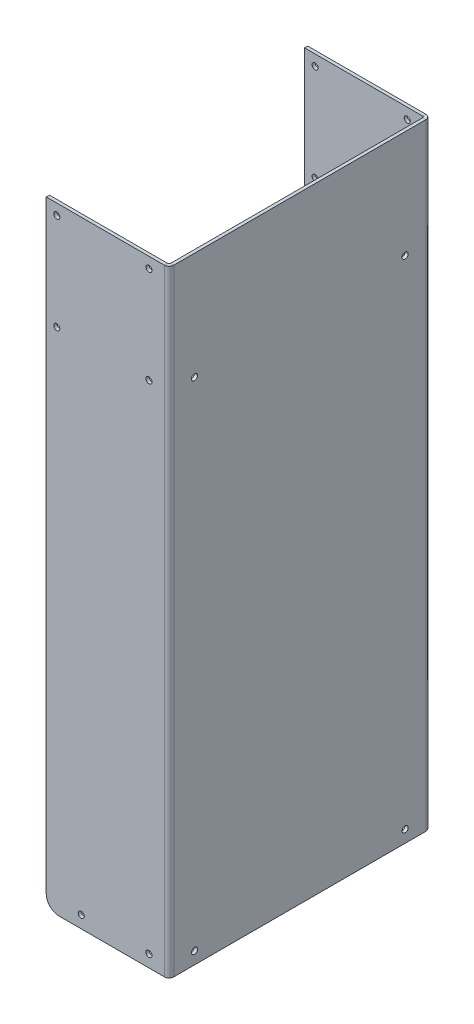
ISO-10303-21;
HEADER;
FILE_DESCRIPTION(('STEP AP214'),'2;1');
FILE_NAME('part.step','',(''),(''),'','','');
FILE_SCHEMA(('AUTOMOTIVE_DESIGN { 1 0 10303 214 1 1 1 1 }'));
ENDSEC;
DATA;
#1=APPLICATION_CONTEXT('core data for automotive mechanical design processes');
#2=APPLICATION_PROTOCOL_DEFINITION('international standard','automotive_design',2000,#1);
#3=PRODUCT_CONTEXT('',#1,'mechanical');
#4=PRODUCT('Part','Part','',(#3));
#5=PRODUCT_RELATED_PRODUCT_CATEGORY('part','',(#4));
#6=PRODUCT_DEFINITION_FORMATION('','',#4);
#7=PRODUCT_DEFINITION_CONTEXT('part definition',#1,'design');
#8=PRODUCT_DEFINITION('design','',#6,#7);
#9=PRODUCT_DEFINITION_SHAPE('','',#8);
#10=(LENGTH_UNIT() NAMED_UNIT(*) SI_UNIT(.MILLI.,.METRE.));
#11=(NAMED_UNIT(*) PLANE_ANGLE_UNIT() SI_UNIT($,.RADIAN.));
#12=(NAMED_UNIT(*) SI_UNIT($,.STERADIAN.) SOLID_ANGLE_UNIT());
#13=UNCERTAINTY_MEASURE_WITH_UNIT(LENGTH_MEASURE(1.E-05),#10,'distance_accuracy_value','');
#14=(GEOMETRIC_REPRESENTATION_CONTEXT(3) GLOBAL_UNCERTAINTY_ASSIGNED_CONTEXT((#13)) GLOBAL_UNIT_ASSIGNED_CONTEXT((#10,
#11,#12)) REPRESENTATION_CONTEXT('',''));
#15=CARTESIAN_POINT('',(0.,0.,0.));
#16=DIRECTION('',(0.,0.,1.));
#17=DIRECTION('',(1.,0.,0.));
#18=AXIS2_PLACEMENT_3D('',#15,#16,#17);
#19=CARTESIAN_POINT('',(1.57,152.4,62.315));
#20=DIRECTION('',(0.,-1.,0.));
#21=DIRECTION('',(0.,0.,-1.));
#22=AXIS2_PLACEMENT_3D('',#19,#20,#21);
#23=PLANE('',#22);
#24=DIRECTION('',(0.,0.,1.));
#25=VECTOR('',#24,1.);
#26=CARTESIAN_POINT('',(0.,152.4,62.315));
#27=LINE('',#26,#25);
#28=CARTESIAN_POINT('',(0.,152.4,-62.315));
#29=VERTEX_POINT('',#28);
#30=CARTESIAN_POINT('',(0.,152.4,62.315));
#31=VERTEX_POINT('',#30);
#32=EDGE_CURVE('E294',#29,#31,#27,.T.);
#33=ORIENTED_EDGE('',*,*,#32,.T.);
#34=DIRECTION('',(-1.,0.,0.));
#35=VECTOR('',#34,1.);
#36=CARTESIAN_POINT('',(1.57,152.4,62.315));
#37=LINE('',#36,#35);
#38=CARTESIAN_POINT('',(1.56999999999999,152.4,62.315));
#39=VERTEX_POINT('',#38);
#40=EDGE_CURVE('E305',#39,#31,#37,.T.);
#41=ORIENTED_EDGE('',*,*,#40,.F.);
#42=DIRECTION('',(0.,0.,1.));
#43=VECTOR('',#42,1.);
#44=CARTESIAN_POINT('',(1.57,152.4,62.315));
#45=LINE('',#44,#43);
#46=CARTESIAN_POINT('',(1.57,152.4,-62.315));
#47=VERTEX_POINT('',#46);
#48=EDGE_CURVE('E282',#47,#39,#45,.T.);
#49=ORIENTED_EDGE('',*,*,#48,.F.);
#50=DIRECTION('',(-1.,0.,0.));
#51=VECTOR('',#50,1.);
#52=CARTESIAN_POINT('',(1.57,152.4,-62.315));
#53=LINE('',#52,#51);
#54=EDGE_CURVE('E307',#47,#29,#53,.T.);
#55=ORIENTED_EDGE('',*,*,#54,.T.);
#56=EDGE_LOOP('',(#33,#41,#49,#55));
#57=FACE_BOUND('',#56,.T.);
#58=ADVANCED_FACE('F80',(#57),#23,.F.);
#59=CARTESIAN_POINT('',(1.57,-152.4,62.315));
#60=DIRECTION('',(0.,1.,0.));
#61=DIRECTION('',(0.,0.,1.));
#62=AXIS2_PLACEMENT_3D('',#59,#60,#61);
#63=PLANE('',#62);
#64=DIRECTION('',(0.,0.,-1.));
#65=VECTOR('',#64,1.);
#66=CARTESIAN_POINT('',(0.,-152.4,62.315));
#67=LINE('',#66,#65);
#68=CARTESIAN_POINT('',(0.,-152.4,62.315));
#69=VERTEX_POINT('',#68);
#70=CARTESIAN_POINT('',(0.,-152.4,-62.315));
#71=VERTEX_POINT('',#70);
#72=EDGE_CURVE('E283',#69,#71,#67,.T.);
#73=ORIENTED_EDGE('',*,*,#72,.T.);
#74=DIRECTION('',(-1.,0.,0.));
#75=VECTOR('',#74,1.);
#76=CARTESIAN_POINT('',(1.57,-152.4,-62.315));
#77=LINE('',#76,#75);
#78=CARTESIAN_POINT('',(1.56999999999999,-152.4,-62.3150000000001));
#79=VERTEX_POINT('',#78);
#80=EDGE_CURVE('E292',#79,#71,#77,.T.);
#81=ORIENTED_EDGE('',*,*,#80,.F.);
#82=DIRECTION('',(0.,0.,-1.));
#83=VECTOR('',#82,1.);
#84=CARTESIAN_POINT('',(1.57,-152.4,62.315));
#85=LINE('',#84,#83);
#86=CARTESIAN_POINT('',(1.57,-152.4,62.315));
#87=VERTEX_POINT('',#86);
#88=EDGE_CURVE('E289',#87,#79,#85,.T.);
#89=ORIENTED_EDGE('',*,*,#88,.F.);
#90=DIRECTION('',(-1.,0.,0.));
#91=VECTOR('',#90,1.);
#92=CARTESIAN_POINT('',(1.57,-152.4,62.315));
#93=LINE('',#92,#91);
#94=EDGE_CURVE('E302',#87,#69,#93,.T.);
#95=ORIENTED_EDGE('',*,*,#94,.T.);
#96=EDGE_LOOP('',(#73,#81,#89,#95));
#97=FACE_BOUND('',#96,.T.);
#98=ADVANCED_FACE('F466',(#97),#63,.F.);
#99=CARTESIAN_POINT('',(1.57,0.,0.));
#100=DIRECTION('',(1.,0.,0.));
#101=DIRECTION('',(0.,0.,-1.));
#102=AXIS2_PLACEMENT_3D('',#99,#100,#101);
#103=PLANE('',#102);
#104=CARTESIAN_POINT('',(1.57,99.2799999999996,-52.085));
#105=DIRECTION('',(1.,0.,0.));
#106=DIRECTION('',(0.,0.,-1.));
#107=AXIS2_PLACEMENT_3D('',#104,#105,#106);
#108=CIRCLE('',#107,1.5);
#109=CARTESIAN_POINT('',(1.57,99.2799999999996,-53.585));
#110=VERTEX_POINT('',#109);
#111=EDGE_CURVE('E362',#110,#110,#108,.T.);
#112=ORIENTED_EDGE('',*,*,#111,.F.);
#113=EDGE_LOOP('',(#112));
#114=FACE_BOUND('',#113,.T.);
#115=CARTESIAN_POINT('',(1.57,99.2799999999996,52.085));
#116=DIRECTION('',(1.,0.,0.));
#117=DIRECTION('',(0.,0.,-1.));
#118=AXIS2_PLACEMENT_3D('',#115,#116,#117);
#119=CIRCLE('',#118,1.5);
#120=CARTESIAN_POINT('',(1.57,99.2799999999996,50.585));
#121=VERTEX_POINT('',#120);
#122=EDGE_CURVE('E367',#121,#121,#119,.T.);
#123=ORIENTED_EDGE('',*,*,#122,.F.);
#124=EDGE_LOOP('',(#123));
#125=FACE_BOUND('',#124,.T.);
#126=CARTESIAN_POINT('',(1.57,-146.37,52.085));
#127=DIRECTION('',(-1.,0.,0.));
#128=DIRECTION('',(0.,0.,1.));
#129=AXIS2_PLACEMENT_3D('',#126,#127,#128);
#130=CIRCLE('',#129,1.5);
#131=CARTESIAN_POINT('',(1.57,-146.37,53.585));
#132=VERTEX_POINT('',#131);
#133=EDGE_CURVE('E359',#132,#132,#130,.T.);
#134=ORIENTED_EDGE('',*,*,#133,.T.);
#135=EDGE_LOOP('',(#134));
#136=FACE_BOUND('',#135,.T.);
#137=CARTESIAN_POINT('',(1.57,-146.37,-52.085));
#138=DIRECTION('',(1.,0.,0.));
#139=DIRECTION('',(0.,0.,-1.));
#140=AXIS2_PLACEMENT_3D('',#137,#138,#139);
#141=CIRCLE('',#140,1.5);
#142=CARTESIAN_POINT('',(1.57,-146.37,-53.585));
#143=VERTEX_POINT('',#142);
#144=EDGE_CURVE('E356',#143,#143,#141,.T.);
#145=ORIENTED_EDGE('',*,*,#144,.F.);
#146=EDGE_LOOP('',(#145));
#147=FACE_BOUND('',#146,.T.);
#148=DIRECTION('',(0.,1.,0.));
#149=VECTOR('',#148,1.);
#150=CARTESIAN_POINT('',(1.57,152.4,-62.315));
#151=LINE('',#150,#149);
#152=EDGE_CURVE('E279',#79,#47,#151,.T.);
#153=ORIENTED_EDGE('',*,*,#152,.T.);
#154=ORIENTED_EDGE('',*,*,#48,.T.);
#155=DIRECTION('',(0.,-1.,0.));
#156=VECTOR('',#155,1.);
#157=CARTESIAN_POINT('',(1.57,152.4,62.315));
#158=LINE('',#157,#156);
#159=EDGE_CURVE('E286',#39,#87,#158,.T.);
#160=ORIENTED_EDGE('',*,*,#159,.T.);
#161=ORIENTED_EDGE('',*,*,#88,.T.);
#162=EDGE_LOOP('',(#153,#154,#160,#161));
#163=FACE_BOUND('',#162,.T.);
#164=ADVANCED_FACE('F472',(#114,#125,#136,#147,#163),#103,.T.);
#165=CARTESIAN_POINT('',(0.,0.,0.));
#166=DIRECTION('',(1.,0.,0.));
#167=DIRECTION('',(0.,0.,-1.));
#168=AXIS2_PLACEMENT_3D('',#165,#166,#167);
#169=PLANE('',#168);
#170=CARTESIAN_POINT('',(0.,99.2799999999996,-52.085));
#171=DIRECTION('',(1.,0.,0.));
#172=DIRECTION('',(0.,0.,-1.));
#173=AXIS2_PLACEMENT_3D('',#170,#171,#172);
#174=CIRCLE('',#173,1.5);
#175=CARTESIAN_POINT('',(0.,99.2799999999996,-53.585));
#176=VERTEX_POINT('',#175);
#177=EDGE_CURVE('E84',#176,#176,#174,.T.);
#178=ORIENTED_EDGE('',*,*,#177,.T.);
#179=EDGE_LOOP('',(#178));
#180=FACE_BOUND('',#179,.T.);
#181=CARTESIAN_POINT('',(0.,99.2799999999996,52.085));
#182=DIRECTION('',(1.,0.,0.));
#183=DIRECTION('',(0.,0.,-1.));
#184=AXIS2_PLACEMENT_3D('',#181,#182,#183);
#185=CIRCLE('',#184,1.5);
#186=CARTESIAN_POINT('',(0.,99.2799999999996,50.585));
#187=VERTEX_POINT('',#186);
#188=EDGE_CURVE('E360',#187,#187,#185,.T.);
#189=ORIENTED_EDGE('',*,*,#188,.T.);
#190=EDGE_LOOP('',(#189));
#191=FACE_BOUND('',#190,.T.);
#192=CARTESIAN_POINT('',(0.,-146.37,52.085));
#193=DIRECTION('',(1.,0.,0.));
#194=DIRECTION('',(0.,0.,-1.));
#195=AXIS2_PLACEMENT_3D('',#192,#193,#194);
#196=CIRCLE('',#195,1.5);
#197=CARTESIAN_POINT('',(0.,-146.37,50.585));
#198=VERTEX_POINT('',#197);
#199=EDGE_CURVE('E357',#198,#198,#196,.F.);
#200=ORIENTED_EDGE('',*,*,#199,.F.);
#201=EDGE_LOOP('',(#200));
#202=FACE_BOUND('',#201,.T.);
#203=CARTESIAN_POINT('',(0.,-146.37,-52.085));
#204=DIRECTION('',(1.,0.,0.));
#205=DIRECTION('',(0.,0.,-1.));
#206=AXIS2_PLACEMENT_3D('',#203,#204,#205);
#207=CIRCLE('',#206,1.5);
#208=CARTESIAN_POINT('',(0.,-146.37,-53.585));
#209=VERTEX_POINT('',#208);
#210=EDGE_CURVE('E352',#209,#209,#207,.T.);
#211=ORIENTED_EDGE('',*,*,#210,.T.);
#212=EDGE_LOOP('',(#211));
#213=FACE_BOUND('',#212,.T.);
#214=DIRECTION('',(0.,1.,0.));
#215=VECTOR('',#214,1.);
#216=CARTESIAN_POINT('',(0.,152.4,-62.315));
#217=LINE('',#216,#215);
#218=EDGE_CURVE('E270',#71,#29,#217,.T.);
#219=ORIENTED_EDGE('',*,*,#218,.F.);
#220=ORIENTED_EDGE('',*,*,#72,.F.);
#221=DIRECTION('',(0.,-1.,0.));
#222=VECTOR('',#221,1.);
#223=CARTESIAN_POINT('',(0.,152.4,62.315));
#224=LINE('',#223,#222);
#225=EDGE_CURVE('E297',#31,#69,#224,.T.);
#226=ORIENTED_EDGE('',*,*,#225,.F.);
#227=ORIENTED_EDGE('',*,*,#32,.F.);
#228=EDGE_LOOP('',(#219,#220,#226,#227));
#229=FACE_BOUND('',#228,.T.);
#230=ADVANCED_FACE('F512',(#180,#191,#202,#213,#229),#169,.F.);
#231=CARTESIAN_POINT('',(-0.75999999999999,-152.4,62.315));
#232=DIRECTION('',(0.,-1.,0.));
#233=DIRECTION('',(0.,0.,-1.));
#234=AXIS2_PLACEMENT_3D('',#231,#232,#233);
#235=PLANE('',#234);
#236=DIRECTION('',(0.,0.,-1.));
#237=VECTOR('',#236,1.);
#238=CARTESIAN_POINT('',(-0.759999999999997,-152.4,64.645));
#239=LINE('',#238,#237);
#240=CARTESIAN_POINT('',(-0.759999999999987,-152.4,63.075));
#241=VERTEX_POINT('',#240);
#242=CARTESIAN_POINT('',(-0.759999999999981,-152.4,64.645));
#243=VERTEX_POINT('',#242);
#244=EDGE_CURVE('E232',#241,#243,#239,.F.);
#245=ORIENTED_EDGE('',*,*,#244,.F.);
#246=CARTESIAN_POINT('',(-0.75999999999999,-152.4,62.315));
#247=DIRECTION('',(0.,1.,0.));
#248=DIRECTION('',(0.,0.,1.));
#249=AXIS2_PLACEMENT_3D('',#246,#247,#248);
#250=CIRCLE('',#249,0.759999999999976);
#251=EDGE_CURVE('E274',#69,#241,#250,.F.);
#252=ORIENTED_EDGE('',*,*,#251,.F.);
#253=ORIENTED_EDGE('',*,*,#94,.F.);
#254=CARTESIAN_POINT('',(-0.75999999999999,-152.4,62.315));
#255=DIRECTION('',(0.,1.,0.));
#256=DIRECTION('',(0.,0.,1.));
#257=AXIS2_PLACEMENT_3D('',#254,#255,#256);
#258=CIRCLE('',#257,2.32999999999998);
#259=EDGE_CURVE('E267',#87,#243,#258,.F.);
#260=ORIENTED_EDGE('',*,*,#259,.T.);
#261=EDGE_LOOP('',(#245,#252,#253,#260));
#262=FACE_BOUND('',#261,.T.);
#263=ADVANCED_FACE('F514',(#262),#235,.T.);
#264=CARTESIAN_POINT('',(-0.75999999999999,152.4,62.315));
#265=DIRECTION('',(0.,-1.,0.));
#266=DIRECTION('',(0.,0.,-1.));
#267=AXIS2_PLACEMENT_3D('',#264,#265,#266);
#268=PLANE('',#267);
#269=CARTESIAN_POINT('',(-0.75999999999999,152.4,62.315));
#270=DIRECTION('',(0.,1.,0.));
#271=DIRECTION('',(0.,0.,1.));
#272=AXIS2_PLACEMENT_3D('',#269,#270,#271);
#273=CIRCLE('',#272,0.759999999999976);
#274=CARTESIAN_POINT('',(-0.759999999999987,152.4,63.075));
#275=VERTEX_POINT('',#274);
#276=EDGE_CURVE('E244',#275,#31,#273,.T.);
#277=ORIENTED_EDGE('',*,*,#276,.F.);
#278=DIRECTION('',(0.,0.,-1.));
#279=VECTOR('',#278,1.);
#280=CARTESIAN_POINT('',(-0.759999999999983,152.4,63.075));
#281=LINE('',#280,#279);
#282=CARTESIAN_POINT('',(-0.759999999999983,152.4,64.645));
#283=VERTEX_POINT('',#282);
#284=EDGE_CURVE('E260',#275,#283,#281,.F.);
#285=ORIENTED_EDGE('',*,*,#284,.T.);
#286=CARTESIAN_POINT('',(-0.75999999999999,152.4,62.315));
#287=DIRECTION('',(0.,1.,0.));
#288=DIRECTION('',(0.,0.,1.));
#289=AXIS2_PLACEMENT_3D('',#286,#287,#288);
#290=CIRCLE('',#289,2.32999999999998);
#291=EDGE_CURVE('E271',#283,#39,#290,.T.);
#292=ORIENTED_EDGE('',*,*,#291,.T.);
#293=ORIENTED_EDGE('',*,*,#40,.T.);
#294=EDGE_LOOP('',(#277,#285,#292,#293));
#295=FACE_BOUND('',#294,.T.);
#296=ADVANCED_FACE('F446',(#295),#268,.F.);
#297=CARTESIAN_POINT('',(-0.75999999999999,152.4,62.315));
#298=DIRECTION('',(0.,1.,0.));
#299=DIRECTION('',(0.,0.,1.));
#300=AXIS2_PLACEMENT_3D('',#297,#298,#299);
#301=CYLINDRICAL_SURFACE('',#300,2.32999999999998);
#302=ORIENTED_EDGE('',*,*,#159,.F.);
#303=ORIENTED_EDGE('',*,*,#291,.F.);
#304=DIRECTION('',(0.,1.,0.));
#305=VECTOR('',#304,1.);
#306=CARTESIAN_POINT('',(-0.759999999999997,-152.4,64.645));
#307=LINE('',#306,#305);
#308=EDGE_CURVE('E257',#283,#243,#307,.F.);
#309=ORIENTED_EDGE('',*,*,#308,.T.);
#310=ORIENTED_EDGE('',*,*,#259,.F.);
#311=EDGE_LOOP('',(#302,#303,#309,#310));
#312=FACE_BOUND('',#311,.T.);
#313=ADVANCED_FACE('F516',(#312),#301,.T.);
#314=CARTESIAN_POINT('',(-0.75999999999999,152.4,62.315));
#315=DIRECTION('',(0.,1.,0.));
#316=DIRECTION('',(0.,0.,1.));
#317=AXIS2_PLACEMENT_3D('',#314,#315,#316);
#318=CYLINDRICAL_SURFACE('',#317,0.759999999999976);
#319=ORIENTED_EDGE('',*,*,#225,.T.);
#320=ORIENTED_EDGE('',*,*,#251,.T.);
#321=DIRECTION('',(0.,1.,0.));
#322=VECTOR('',#321,1.);
#323=CARTESIAN_POINT('',(-0.759999999999997,-152.4,63.075));
#324=LINE('',#323,#322);
#325=EDGE_CURVE('E263',#241,#275,#324,.T.);
#326=ORIENTED_EDGE('',*,*,#325,.T.);
#327=ORIENTED_EDGE('',*,*,#276,.T.);
#328=EDGE_LOOP('',(#319,#320,#326,#327));
#329=FACE_BOUND('',#328,.T.);
#330=ADVANCED_FACE('F442',(#329),#318,.F.);
#331=CARTESIAN_POINT('',(-59.18,152.4,64.6450000000002));
#332=DIRECTION('',(0.,-1.,0.));
#333=DIRECTION('',(0.,0.,-1.));
#334=AXIS2_PLACEMENT_3D('',#331,#332,#333);
#335=PLANE('',#334);
#336=ORIENTED_EDGE('',*,*,#284,.F.);
#337=DIRECTION('',(1.,0.,0.));
#338=VECTOR('',#337,1.);
#339=CARTESIAN_POINT('',(-59.18,152.4,63.0750000000002));
#340=LINE('',#339,#338);
#341=CARTESIAN_POINT('',(-59.18,152.4,63.0750000000002));
#342=VERTEX_POINT('',#341);
#343=EDGE_CURVE('E255',#275,#342,#340,.F.);
#344=ORIENTED_EDGE('',*,*,#343,.T.);
#345=DIRECTION('',(0.,0.,-1.));
#346=VECTOR('',#345,1.);
#347=CARTESIAN_POINT('',(-59.18,152.4,64.6450000000002));
#348=LINE('',#347,#346);
#349=CARTESIAN_POINT('',(-59.18,152.4,64.6450000000002));
#350=VERTEX_POINT('',#349);
#351=EDGE_CURVE('E241',#350,#342,#348,.T.);
#352=ORIENTED_EDGE('',*,*,#351,.F.);
#353=DIRECTION('',(-1.,0.,0.));
#354=VECTOR('',#353,1.);
#355=CARTESIAN_POINT('',(2.24675867146042E-13,152.4,64.645));
#356=LINE('',#355,#354);
#357=EDGE_CURVE('E249',#283,#350,#356,.T.);
#358=ORIENTED_EDGE('',*,*,#357,.F.);
#359=EDGE_LOOP('',(#336,#344,#352,#358));
#360=FACE_BOUND('',#359,.T.);
#361=ADVANCED_FACE('F449',(#360),#335,.F.);
#362=CARTESIAN_POINT('',(0.,-152.4,64.645));
#363=DIRECTION('',(0.,1.,0.));
#364=DIRECTION('',(0.,0.,1.));
#365=AXIS2_PLACEMENT_3D('',#362,#363,#364);
#366=PLANE('',#365);
#367=DIRECTION('',(1.,0.,0.));
#368=VECTOR('',#367,1.);
#369=CARTESIAN_POINT('',(2.24675867146042E-13,-152.4,64.645));
#370=LINE('',#369,#368);
#371=CARTESIAN_POINT('',(-52.83,-152.4,64.6450000000001));
#372=VERTEX_POINT('',#371);
#373=EDGE_CURVE('E245',#372,#243,#370,.T.);
#374=ORIENTED_EDGE('',*,*,#373,.F.);
#375=DIRECTION('',(0.,0.,-1.));
#376=VECTOR('',#375,1.);
#377=CARTESIAN_POINT('',(-52.83,-152.4,64.6450000000002));
#378=LINE('',#377,#376);
#379=CARTESIAN_POINT('',(-52.83,-152.4,63.0750000000001));
#380=VERTEX_POINT('',#379);
#381=EDGE_CURVE('E317',#372,#380,#378,.T.);
#382=ORIENTED_EDGE('',*,*,#381,.T.);
#383=DIRECTION('',(-1.,0.,0.));
#384=VECTOR('',#383,1.);
#385=CARTESIAN_POINT('',(0.,-152.4,63.075));
#386=LINE('',#385,#384);
#387=EDGE_CURVE('E251',#380,#241,#386,.F.);
#388=ORIENTED_EDGE('',*,*,#387,.T.);
#389=ORIENTED_EDGE('',*,*,#244,.T.);
#390=EDGE_LOOP('',(#374,#382,#388,#389));
#391=FACE_BOUND('',#390,.T.);
#392=ADVANCED_FACE('F424',(#391),#366,.F.);
#393=CARTESIAN_POINT('',(2.24675867146042E-13,0.,64.645));
#394=DIRECTION('',(0.,0.,-1.));
#395=DIRECTION('',(-1.,0.,0.));
#396=AXIS2_PLACEMENT_3D('',#393,#394,#395);
#397=PLANE('',#396);
#398=CARTESIAN_POINT('',(-53.950000000001,99.2799999999999,64.6450000000002));
#399=DIRECTION('',(0.,0.,-1.));
#400=DIRECTION('',(-1.,0.,0.));
#401=AXIS2_PLACEMENT_3D('',#398,#399,#400);
#402=CIRCLE('',#401,1.5);
#403=CARTESIAN_POINT('',(-55.450000000001,99.2799999999999,64.6450000000002));
#404=VERTEX_POINT('',#403);
#405=EDGE_CURVE('E402',#404,#404,#402,.T.);
#406=ORIENTED_EDGE('',*,*,#405,.T.);
#407=EDGE_LOOP('',(#406));
#408=FACE_BOUND('',#407,.T.);
#409=CARTESIAN_POINT('',(-8.38000000000095,99.2799999999996,64.645));
#410=DIRECTION('',(0.,0.,-1.));
#411=DIRECTION('',(-1.,0.,0.));
#412=AXIS2_PLACEMENT_3D('',#409,#410,#411);
#413=CIRCLE('',#412,1.5);
#414=CARTESIAN_POINT('',(-9.88000000000096,99.2799999999996,64.645));
#415=VERTEX_POINT('',#414);
#416=EDGE_CURVE('E351',#415,#415,#413,.T.);
#417=ORIENTED_EDGE('',*,*,#416,.T.);
#418=EDGE_LOOP('',(#417));
#419=FACE_BOUND('',#418,.T.);
#420=CARTESIAN_POINT('',(-8.38000000000046,147.08,64.645));
#421=DIRECTION('',(0.,0.,-1.));
#422=DIRECTION('',(-1.,0.,0.));
#423=AXIS2_PLACEMENT_3D('',#420,#421,#422);
#424=CIRCLE('',#423,1.5);
#425=CARTESIAN_POINT('',(-9.88000000000046,147.08,64.645));
#426=VERTEX_POINT('',#425);
#427=EDGE_CURVE('E346',#426,#426,#424,.T.);
#428=ORIENTED_EDGE('',*,*,#427,.T.);
#429=EDGE_LOOP('',(#428));
#430=FACE_BOUND('',#429,.T.);
#431=CARTESIAN_POINT('',(-53.9500000000005,147.08,64.6450000000002));
#432=DIRECTION('',(0.,0.,-1.));
#433=DIRECTION('',(-1.,0.,0.));
#434=AXIS2_PLACEMENT_3D('',#431,#432,#433);
#435=CIRCLE('',#434,1.5);
#436=CARTESIAN_POINT('',(-55.4500000000005,147.08,64.6450000000002));
#437=VERTEX_POINT('',#436);
#438=EDGE_CURVE('E341',#437,#437,#435,.T.);
#439=ORIENTED_EDGE('',*,*,#438,.T.);
#440=EDGE_LOOP('',(#439));
#441=FACE_BOUND('',#440,.T.);
#442=CARTESIAN_POINT('',(-41.8600000000005,-146.37,64.6450000000001));
#443=DIRECTION('',(0.,0.,-1.));
#444=DIRECTION('',(-1.,0.,0.));
#445=AXIS2_PLACEMENT_3D('',#442,#443,#444);
#446=CIRCLE('',#445,1.5);
#447=CARTESIAN_POINT('',(-43.3600000000005,-146.37,64.6450000000001));
#448=VERTEX_POINT('',#447);
#449=EDGE_CURVE('E228',#448,#448,#446,.F.);
#450=ORIENTED_EDGE('',*,*,#449,.F.);
#451=EDGE_LOOP('',(#450));
#452=FACE_BOUND('',#451,.T.);
#453=CARTESIAN_POINT('',(-8.39000000000046,-146.37,64.645));
#454=DIRECTION('',(0.,0.,-1.));
#455=DIRECTION('',(-1.,0.,0.));
#456=AXIS2_PLACEMENT_3D('',#453,#454,#455);
#457=CIRCLE('',#456,1.5);
#458=CARTESIAN_POINT('',(-9.89000000000046,-146.37,64.645));
#459=VERTEX_POINT('',#458);
#460=EDGE_CURVE('E331',#459,#459,#457,.F.);
#461=ORIENTED_EDGE('',*,*,#460,.F.);
#462=EDGE_LOOP('',(#461));
#463=FACE_BOUND('',#462,.T.);
#464=DIRECTION('',(0.,-1.,0.));
#465=VECTOR('',#464,1.);
#466=CARTESIAN_POINT('',(-59.18,0.,64.6450000000002));
#467=LINE('',#466,#465);
#468=CARTESIAN_POINT('',(-59.18,-146.05,64.6450000000002));
#469=VERTEX_POINT('',#468);
#470=EDGE_CURVE('E247',#350,#469,#467,.T.);
#471=ORIENTED_EDGE('',*,*,#470,.T.);
#472=CARTESIAN_POINT('',(-52.83,-146.05,64.6450000000002));
#473=DIRECTION('',(0.,0.,-1.));
#474=DIRECTION('',(-1.,0.,0.));
#475=AXIS2_PLACEMENT_3D('',#472,#473,#474);
#476=CIRCLE('',#475,6.35);
#477=EDGE_CURVE('E13',#469,#372,#476,.F.);
#478=ORIENTED_EDGE('',*,*,#477,.T.);
#479=ORIENTED_EDGE('',*,*,#373,.T.);
#480=ORIENTED_EDGE('',*,*,#308,.F.);
#481=ORIENTED_EDGE('',*,*,#357,.T.);
#482=EDGE_LOOP('',(#471,#478,#479,#480,#481));
#483=FACE_BOUND('',#482,.T.);
#484=ADVANCED_FACE('F420',(#408,#419,#430,#441,#452,#463,#483),#397,.F.);
#485=CARTESIAN_POINT('',(2.19194241444058E-13,0.,63.075));
#486=DIRECTION('',(0.,0.,-1.));
#487=DIRECTION('',(-1.,0.,0.));
#488=AXIS2_PLACEMENT_3D('',#485,#486,#487);
#489=PLANE('',#488);
#490=CARTESIAN_POINT('',(-53.9500000000009,99.2799999999999,63.0750000000002));
#491=DIRECTION('',(0.,0.,-1.));
#492=DIRECTION('',(-1.,0.,0.));
#493=AXIS2_PLACEMENT_3D('',#490,#491,#492);
#494=CIRCLE('',#493,1.5);
#495=CARTESIAN_POINT('',(-55.4500000000009,99.2799999999999,63.0750000000002));
#496=VERTEX_POINT('',#495);
#497=EDGE_CURVE('E350',#496,#496,#494,.T.);
#498=ORIENTED_EDGE('',*,*,#497,.F.);
#499=EDGE_LOOP('',(#498));
#500=FACE_BOUND('',#499,.T.);
#501=CARTESIAN_POINT('',(-8.38000000000095,99.2799999999996,63.075));
#502=DIRECTION('',(0.,0.,-1.));
#503=DIRECTION('',(-1.,0.,0.));
#504=AXIS2_PLACEMENT_3D('',#501,#502,#503);
#505=CIRCLE('',#504,1.5);
#506=CARTESIAN_POINT('',(-9.88000000000095,99.2799999999996,63.075));
#507=VERTEX_POINT('',#506);
#508=EDGE_CURVE('E345',#507,#507,#505,.T.);
#509=ORIENTED_EDGE('',*,*,#508,.F.);
#510=EDGE_LOOP('',(#509));
#511=FACE_BOUND('',#510,.T.);
#512=CARTESIAN_POINT('',(-8.38000000000045,147.08,63.075));
#513=DIRECTION('',(0.,0.,-1.));
#514=DIRECTION('',(-1.,0.,0.));
#515=AXIS2_PLACEMENT_3D('',#512,#513,#514);
#516=CIRCLE('',#515,1.5);
#517=CARTESIAN_POINT('',(-9.88000000000045,147.08,63.075));
#518=VERTEX_POINT('',#517);
#519=EDGE_CURVE('E340',#518,#518,#516,.T.);
#520=ORIENTED_EDGE('',*,*,#519,.F.);
#521=EDGE_LOOP('',(#520));
#522=FACE_BOUND('',#521,.T.);
#523=CARTESIAN_POINT('',(-53.9500000000005,147.08,63.0750000000002));
#524=DIRECTION('',(0.,0.,-1.));
#525=DIRECTION('',(-1.,0.,0.));
#526=AXIS2_PLACEMENT_3D('',#523,#524,#525);
#527=CIRCLE('',#526,1.5);
#528=CARTESIAN_POINT('',(-55.4500000000005,147.08,63.0750000000002));
#529=VERTEX_POINT('',#528);
#530=EDGE_CURVE('E335',#529,#529,#527,.T.);
#531=ORIENTED_EDGE('',*,*,#530,.F.);
#532=EDGE_LOOP('',(#531));
#533=FACE_BOUND('',#532,.T.);
#534=CARTESIAN_POINT('',(-41.8600000000005,-146.37,63.0750000000001));
#535=DIRECTION('',(0.,0.,-1.));
#536=DIRECTION('',(-1.,0.,0.));
#537=AXIS2_PLACEMENT_3D('',#534,#535,#536);
#538=CIRCLE('',#537,1.5);
#539=CARTESIAN_POINT('',(-43.3600000000005,-146.37,63.0750000000001));
#540=VERTEX_POINT('',#539);
#541=EDGE_CURVE('E330',#540,#540,#538,.F.);
#542=ORIENTED_EDGE('',*,*,#541,.T.);
#543=EDGE_LOOP('',(#542));
#544=FACE_BOUND('',#543,.T.);
#545=CARTESIAN_POINT('',(-8.39000000000045,-146.37,63.075));
#546=DIRECTION('',(0.,0.,-1.));
#547=DIRECTION('',(-1.,0.,0.));
#548=AXIS2_PLACEMENT_3D('',#545,#546,#547);
#549=CIRCLE('',#548,1.5);
#550=CARTESIAN_POINT('',(-9.89000000000046,-146.37,63.075));
#551=VERTEX_POINT('',#550);
#552=EDGE_CURVE('E325',#551,#551,#549,.F.);
#553=ORIENTED_EDGE('',*,*,#552,.T.);
#554=EDGE_LOOP('',(#553));
#555=FACE_BOUND('',#554,.T.);
#556=ORIENTED_EDGE('',*,*,#387,.F.);
#557=CARTESIAN_POINT('',(-52.83,-146.05,63.0750000000002));
#558=DIRECTION('',(0.,0.,-1.));
#559=DIRECTION('',(-1.,0.,0.));
#560=AXIS2_PLACEMENT_3D('',#557,#558,#559);
#561=CIRCLE('',#560,6.35);
#562=CARTESIAN_POINT('',(-59.18,-146.05,63.0750000000002));
#563=VERTEX_POINT('',#562);
#564=EDGE_CURVE('E104',#380,#563,#561,.T.);
#565=ORIENTED_EDGE('',*,*,#564,.T.);
#566=DIRECTION('',(0.,1.,0.));
#567=VECTOR('',#566,1.);
#568=CARTESIAN_POINT('',(-59.18,-152.4,63.0750000000002));
#569=LINE('',#568,#567);
#570=EDGE_CURVE('E253',#342,#563,#569,.F.);
#571=ORIENTED_EDGE('',*,*,#570,.F.);
#572=ORIENTED_EDGE('',*,*,#343,.F.);
#573=ORIENTED_EDGE('',*,*,#325,.F.);
#574=EDGE_LOOP('',(#556,#565,#571,#572,#573));
#575=FACE_BOUND('',#574,.T.);
#576=ADVANCED_FACE('F423',(#500,#511,#522,#533,#544,#555,#575),#489,.T.);
#577=CARTESIAN_POINT('',(-59.18,-152.4,64.6450000000002));
#578=DIRECTION('',(1.,0.,0.));
#579=DIRECTION('',(0.,0.,-1.));
#580=AXIS2_PLACEMENT_3D('',#577,#578,#579);
#581=PLANE('',#580);
#582=ORIENTED_EDGE('',*,*,#570,.T.);
#583=DIRECTION('',(0.,0.,-1.));
#584=VECTOR('',#583,1.);
#585=CARTESIAN_POINT('',(-59.18,-146.05,64.6450000000002));
#586=LINE('',#585,#584);
#587=EDGE_CURVE('E89',#563,#469,#586,.F.);
#588=ORIENTED_EDGE('',*,*,#587,.T.);
#589=ORIENTED_EDGE('',*,*,#470,.F.);
#590=ORIENTED_EDGE('',*,*,#351,.T.);
#591=EDGE_LOOP('',(#582,#588,#589,#590));
#592=FACE_BOUND('',#591,.T.);
#593=ADVANCED_FACE('F450',(#592),#581,.F.);
#594=CARTESIAN_POINT('',(-0.759999999999997,152.4,-62.315));
#595=DIRECTION('',(0.,1.,0.));
#596=DIRECTION('',(0.,0.,1.));
#597=AXIS2_PLACEMENT_3D('',#594,#595,#596);
#598=PLANE('',#597);
#599=DIRECTION('',(0.,0.,1.));
#600=VECTOR('',#599,1.);
#601=CARTESIAN_POINT('',(-0.759999999999997,152.4,-64.645));
#602=LINE('',#601,#600);
#603=CARTESIAN_POINT('',(-0.759999999999994,152.4,-63.075));
#604=VERTEX_POINT('',#603);
#605=CARTESIAN_POINT('',(-0.759999999999988,152.4,-64.645));
#606=VERTEX_POINT('',#605);
#607=EDGE_CURVE('E209',#604,#606,#602,.F.);
#608=ORIENTED_EDGE('',*,*,#607,.F.);
#609=CARTESIAN_POINT('',(-0.759999999999997,152.4,-62.315));
#610=DIRECTION('',(0.,-1.,0.));
#611=DIRECTION('',(0.,0.,-1.));
#612=AXIS2_PLACEMENT_3D('',#609,#610,#611);
#613=CIRCLE('',#612,0.75999999999999);
#614=EDGE_CURVE('E236',#29,#604,#613,.F.);
#615=ORIENTED_EDGE('',*,*,#614,.F.);
#616=ORIENTED_EDGE('',*,*,#54,.F.);
#617=CARTESIAN_POINT('',(-0.759999999999997,152.4,-62.315));
#618=DIRECTION('',(0.,-1.,0.));
#619=DIRECTION('',(0.,0.,-1.));
#620=AXIS2_PLACEMENT_3D('',#617,#618,#619);
#621=CIRCLE('',#620,2.32999999999999);
#622=EDGE_CURVE('E229',#47,#606,#621,.F.);
#623=ORIENTED_EDGE('',*,*,#622,.T.);
#624=EDGE_LOOP('',(#608,#615,#616,#623));
#625=FACE_BOUND('',#624,.T.);
#626=ADVANCED_FACE('F452',(#625),#598,.T.);
#627=CARTESIAN_POINT('',(-0.759999999999997,-152.4,-62.315));
#628=DIRECTION('',(0.,1.,0.));
#629=DIRECTION('',(0.,0.,1.));
#630=AXIS2_PLACEMENT_3D('',#627,#628,#629);
#631=PLANE('',#630);
#632=CARTESIAN_POINT('',(-0.759999999999997,-152.4,-62.315));
#633=DIRECTION('',(0.,-1.,0.));
#634=DIRECTION('',(0.,0.,-1.));
#635=AXIS2_PLACEMENT_3D('',#632,#633,#634);
#636=CIRCLE('',#635,0.75999999999999);
#637=CARTESIAN_POINT('',(-0.759999999999994,-152.4,-63.075));
#638=VERTEX_POINT('',#637);
#639=EDGE_CURVE('E205',#638,#71,#636,.T.);
#640=ORIENTED_EDGE('',*,*,#639,.F.);
#641=DIRECTION('',(0.,0.,1.));
#642=VECTOR('',#641,1.);
#643=CARTESIAN_POINT('',(-0.759999999999997,-152.4,-63.075));
#644=LINE('',#643,#642);
#645=CARTESIAN_POINT('',(-0.759999999999997,-152.4,-64.645));
#646=VERTEX_POINT('',#645);
#647=EDGE_CURVE('E222',#638,#646,#644,.F.);
#648=ORIENTED_EDGE('',*,*,#647,.T.);
#649=CARTESIAN_POINT('',(-0.759999999999997,-152.4,-62.315));
#650=DIRECTION('',(0.,-1.,0.));
#651=DIRECTION('',(0.,0.,-1.));
#652=AXIS2_PLACEMENT_3D('',#649,#650,#651);
#653=CIRCLE('',#652,2.32999999999999);
#654=EDGE_CURVE('E233',#646,#79,#653,.T.);
#655=ORIENTED_EDGE('',*,*,#654,.T.);
#656=ORIENTED_EDGE('',*,*,#80,.T.);
#657=EDGE_LOOP('',(#640,#648,#655,#656));
#658=FACE_BOUND('',#657,.T.);
#659=ADVANCED_FACE('F458',(#658),#631,.F.);
#660=CARTESIAN_POINT('',(-0.759999999999997,-152.4,-62.315));
#661=DIRECTION('',(0.,-1.,0.));
#662=DIRECTION('',(0.,0.,-1.));
#663=AXIS2_PLACEMENT_3D('',#660,#661,#662);
#664=CYLINDRICAL_SURFACE('',#663,2.32999999999999);
#665=ORIENTED_EDGE('',*,*,#152,.F.);
#666=ORIENTED_EDGE('',*,*,#654,.F.);
#667=DIRECTION('',(0.,-1.,0.));
#668=VECTOR('',#667,1.);
#669=CARTESIAN_POINT('',(-0.759999999999997,152.4,-64.645));
#670=LINE('',#669,#668);
#671=EDGE_CURVE('E220',#646,#606,#670,.F.);
#672=ORIENTED_EDGE('',*,*,#671,.T.);
#673=ORIENTED_EDGE('',*,*,#622,.F.);
#674=EDGE_LOOP('',(#665,#666,#672,#673));
#675=FACE_BOUND('',#674,.T.);
#676=ADVANCED_FACE('F501',(#675),#664,.T.);
#677=CARTESIAN_POINT('',(-0.759999999999997,-152.4,-62.315));
#678=DIRECTION('',(0.,-1.,0.));
#679=DIRECTION('',(0.,0.,-1.));
#680=AXIS2_PLACEMENT_3D('',#677,#678,#679);
#681=CYLINDRICAL_SURFACE('',#680,0.75999999999999);
#682=ORIENTED_EDGE('',*,*,#218,.T.);
#683=ORIENTED_EDGE('',*,*,#614,.T.);
#684=DIRECTION('',(0.,-1.,0.));
#685=VECTOR('',#684,1.);
#686=CARTESIAN_POINT('',(-0.759999999999997,152.4,-63.075));
#687=LINE('',#686,#685);
#688=EDGE_CURVE('E225',#604,#638,#687,.T.);
#689=ORIENTED_EDGE('',*,*,#688,.T.);
#690=ORIENTED_EDGE('',*,*,#639,.T.);
#691=EDGE_LOOP('',(#682,#683,#689,#690));
#692=FACE_BOUND('',#691,.T.);
#693=ADVANCED_FACE('F492',(#692),#681,.F.);
#694=CARTESIAN_POINT('',(-59.18,-152.4,-64.6450000000002));
#695=DIRECTION('',(0.,1.,0.));
#696=DIRECTION('',(-1.,0.,0.));
#697=AXIS2_PLACEMENT_3D('',#694,#695,#696);
#698=PLANE('',#697);
#699=DIRECTION('',(1.,0.,0.));
#700=VECTOR('',#699,1.);
#701=CARTESIAN_POINT('',(-59.18,-152.4,-63.0750000000002));
#702=LINE('',#701,#700);
#703=CARTESIAN_POINT('',(-52.83,-152.4,-63.0750000000002));
#704=VERTEX_POINT('',#703);
#705=EDGE_CURVE('E217',#638,#704,#702,.F.);
#706=ORIENTED_EDGE('',*,*,#705,.T.);
#707=DIRECTION('',(0.,0.,1.));
#708=VECTOR('',#707,1.);
#709=CARTESIAN_POINT('',(-52.83,-152.4,-64.6450000000002));
#710=LINE('',#709,#708);
#711=CARTESIAN_POINT('',(-52.83,-152.4,-64.6450000000002));
#712=VERTEX_POINT('',#711);
#713=EDGE_CURVE('E314',#704,#712,#710,.F.);
#714=ORIENTED_EDGE('',*,*,#713,.T.);
#715=DIRECTION('',(-1.,0.,0.));
#716=VECTOR('',#715,1.);
#717=CARTESIAN_POINT('',(2.96151867886526E-13,-152.4,-64.645));
#718=LINE('',#717,#716);
#719=EDGE_CURVE('E195',#646,#712,#718,.T.);
#720=ORIENTED_EDGE('',*,*,#719,.F.);
#721=ORIENTED_EDGE('',*,*,#647,.F.);
#722=EDGE_LOOP('',(#706,#714,#720,#721));
#723=FACE_BOUND('',#722,.T.);
#724=ADVANCED_FACE('F499',(#723),#698,.F.);
#725=CARTESIAN_POINT('',(0.,152.4,-64.645));
#726=DIRECTION('',(0.,-1.,0.));
#727=DIRECTION('',(1.,0.,0.));
#728=AXIS2_PLACEMENT_3D('',#725,#726,#727);
#729=PLANE('',#728);
#730=ORIENTED_EDGE('',*,*,#607,.T.);
#731=DIRECTION('',(1.,0.,0.));
#732=VECTOR('',#731,1.);
#733=CARTESIAN_POINT('',(1.53199866405558E-13,152.4,-64.645));
#734=LINE('',#733,#732);
#735=CARTESIAN_POINT('',(-59.18,152.4,-64.6450000000002));
#736=VERTEX_POINT('',#735);
#737=EDGE_CURVE('E189',#736,#606,#734,.T.);
#738=ORIENTED_EDGE('',*,*,#737,.F.);
#739=DIRECTION('',(0.,0.,1.));
#740=VECTOR('',#739,1.);
#741=CARTESIAN_POINT('',(-59.18,152.4,-64.6450000000002));
#742=LINE('',#741,#740);
#743=CARTESIAN_POINT('',(-59.18,152.4,-63.0750000000002));
#744=VERTEX_POINT('',#743);
#745=EDGE_CURVE('E198',#736,#744,#742,.T.);
#746=ORIENTED_EDGE('',*,*,#745,.T.);
#747=DIRECTION('',(-1.,0.,0.));
#748=VECTOR('',#747,1.);
#749=CARTESIAN_POINT('',(0.,152.4,-63.075));
#750=LINE('',#749,#748);
#751=EDGE_CURVE('E214',#744,#604,#750,.F.);
#752=ORIENTED_EDGE('',*,*,#751,.T.);
#753=EDGE_LOOP('',(#730,#738,#746,#752));
#754=FACE_BOUND('',#753,.T.);
#755=ADVANCED_FACE('F208',(#754),#729,.F.);
#756=CARTESIAN_POINT('',(2.24675867146042E-13,0.,-64.645));
#757=DIRECTION('',(0.,0.,1.));
#758=DIRECTION('',(1.,0.,0.));
#759=AXIS2_PLACEMENT_3D('',#756,#757,#758);
#760=PLANE('',#759);
#761=CARTESIAN_POINT('',(-53.9500000000005,99.28,-64.6450000000002));
#762=DIRECTION('',(0.,0.,-1.));
#763=DIRECTION('',(-1.,0.,0.));
#764=AXIS2_PLACEMENT_3D('',#761,#762,#763);
#765=CIRCLE('',#764,1.5);
#766=CARTESIAN_POINT('',(-55.4500000000005,99.28,-64.6450000000002));
#767=VERTEX_POINT('',#766);
#768=EDGE_CURVE('E355',#767,#767,#765,.T.);
#769=ORIENTED_EDGE('',*,*,#768,.F.);
#770=EDGE_LOOP('',(#769));
#771=FACE_BOUND('',#770,.T.);
#772=CARTESIAN_POINT('',(-8.3800000000005,99.2799999999996,-64.645));
#773=DIRECTION('',(0.,0.,-1.));
#774=DIRECTION('',(-1.,0.,0.));
#775=AXIS2_PLACEMENT_3D('',#772,#773,#774);
#776=CIRCLE('',#775,1.5);
#777=CARTESIAN_POINT('',(-9.88000000000051,99.2799999999996,-64.645));
#778=VERTEX_POINT('',#777);
#779=EDGE_CURVE('E381',#778,#778,#776,.T.);
#780=ORIENTED_EDGE('',*,*,#779,.F.);
#781=EDGE_LOOP('',(#780));
#782=FACE_BOUND('',#781,.T.);
#783=CARTESIAN_POINT('',(-8.38,147.08,-64.645));
#784=DIRECTION('',(0.,0.,-1.));
#785=DIRECTION('',(-1.,0.,0.));
#786=AXIS2_PLACEMENT_3D('',#783,#784,#785);
#787=CIRCLE('',#786,1.5);
#788=CARTESIAN_POINT('',(-9.88,147.08,-64.645));
#789=VERTEX_POINT('',#788);
#790=EDGE_CURVE('E378',#789,#789,#787,.T.);
#791=ORIENTED_EDGE('',*,*,#790,.F.);
#792=EDGE_LOOP('',(#791));
#793=FACE_BOUND('',#792,.T.);
#794=CARTESIAN_POINT('',(-53.95,147.08,-64.6450000000002));
#795=DIRECTION('',(0.,0.,-1.));
#796=DIRECTION('',(-1.,0.,0.));
#797=AXIS2_PLACEMENT_3D('',#794,#795,#796);
#798=CIRCLE('',#797,1.5);
#799=CARTESIAN_POINT('',(-55.45,147.08,-64.6450000000002));
#800=VERTEX_POINT('',#799);
#801=EDGE_CURVE('E336',#800,#800,#798,.T.);
#802=ORIENTED_EDGE('',*,*,#801,.F.);
#803=EDGE_LOOP('',(#802));
#804=FACE_BOUND('',#803,.T.);
#805=CARTESIAN_POINT('',(-41.86,-146.37,-64.6450000000002));
#806=DIRECTION('',(0.,0.,1.));
#807=DIRECTION('',(1.,0.,0.));
#808=AXIS2_PLACEMENT_3D('',#805,#806,#807);
#809=CIRCLE('',#808,1.5);
#810=CARTESIAN_POINT('',(-40.36,-146.37,-64.6450000000002));
#811=VERTEX_POINT('',#810);
#812=EDGE_CURVE('E326',#811,#811,#809,.T.);
#813=ORIENTED_EDGE('',*,*,#812,.T.);
#814=EDGE_LOOP('',(#813));
#815=FACE_BOUND('',#814,.T.);
#816=CARTESIAN_POINT('',(-8.39,-146.37,-64.6450000000001));
#817=DIRECTION('',(0.,0.,1.));
#818=DIRECTION('',(1.,0.,0.));
#819=AXIS2_PLACEMENT_3D('',#816,#817,#818);
#820=CIRCLE('',#819,1.5);
#821=CARTESIAN_POINT('',(-6.89,-146.37,-64.6450000000001));
#822=VERTEX_POINT('',#821);
#823=EDGE_CURVE('E405',#822,#822,#820,.T.);
#824=ORIENTED_EDGE('',*,*,#823,.T.);
#825=EDGE_LOOP('',(#824));
#826=FACE_BOUND('',#825,.T.);
#827=ORIENTED_EDGE('',*,*,#719,.T.);
#828=CARTESIAN_POINT('',(-52.83,-146.05,-64.6450000000002));
#829=DIRECTION('',(0.,0.,1.));
#830=DIRECTION('',(1.,0.,0.));
#831=AXIS2_PLACEMENT_3D('',#828,#829,#830);
#832=CIRCLE('',#831,6.35);
#833=CARTESIAN_POINT('',(-59.18,-146.05,-64.6450000000002));
#834=VERTEX_POINT('',#833);
#835=EDGE_CURVE('E191',#712,#834,#832,.F.);
#836=ORIENTED_EDGE('',*,*,#835,.T.);
#837=DIRECTION('',(0.,1.,0.));
#838=VECTOR('',#837,1.);
#839=CARTESIAN_POINT('',(-59.18,0.,-64.6450000000002));
#840=LINE('',#839,#838);
#841=EDGE_CURVE('E183',#834,#736,#840,.T.);
#842=ORIENTED_EDGE('',*,*,#841,.T.);
#843=ORIENTED_EDGE('',*,*,#737,.T.);
#844=ORIENTED_EDGE('',*,*,#671,.F.);
#845=EDGE_LOOP('',(#827,#836,#842,#843,#844));
#846=FACE_BOUND('',#845,.T.);
#847=ADVANCED_FACE('F186',(#771,#782,#793,#804,#815,#826,#846),#760,.F.);
#848=CARTESIAN_POINT('',(2.19194241444058E-13,0.,-63.075));
#849=DIRECTION('',(0.,0.,1.));
#850=DIRECTION('',(1.,0.,0.));
#851=AXIS2_PLACEMENT_3D('',#848,#849,#850);
#852=PLANE('',#851);
#853=CARTESIAN_POINT('',(-53.9500000000005,99.2799999999999,-63.0750000000002));
#854=DIRECTION('',(0.,0.,1.));
#855=DIRECTION('',(1.,0.,0.));
#856=AXIS2_PLACEMENT_3D('',#853,#854,#855);
#857=CIRCLE('',#856,1.5);
#858=CARTESIAN_POINT('',(-52.4500000000005,99.2799999999999,-63.0750000000002));
#859=VERTEX_POINT('',#858);
#860=EDGE_CURVE('E347',#859,#859,#857,.T.);
#861=ORIENTED_EDGE('',*,*,#860,.F.);
#862=EDGE_LOOP('',(#861));
#863=FACE_BOUND('',#862,.T.);
#864=CARTESIAN_POINT('',(-8.38000000000051,99.2799999999996,-63.075));
#865=DIRECTION('',(0.,0.,1.));
#866=DIRECTION('',(1.,0.,0.));
#867=AXIS2_PLACEMENT_3D('',#864,#865,#866);
#868=CIRCLE('',#867,1.5);
#869=CARTESIAN_POINT('',(-6.8800000000005,99.2799999999996,-63.075));
#870=VERTEX_POINT('',#869);
#871=EDGE_CURVE('E342',#870,#870,#868,.T.);
#872=ORIENTED_EDGE('',*,*,#871,.F.);
#873=EDGE_LOOP('',(#872));
#874=FACE_BOUND('',#873,.T.);
#875=CARTESIAN_POINT('',(-8.38000000000001,147.08,-63.075));
#876=DIRECTION('',(0.,0.,1.));
#877=DIRECTION('',(1.,0.,0.));
#878=AXIS2_PLACEMENT_3D('',#875,#876,#877);
#879=CIRCLE('',#878,1.5);
#880=CARTESIAN_POINT('',(-6.88,147.08,-63.075));
#881=VERTEX_POINT('',#880);
#882=EDGE_CURVE('E337',#881,#881,#879,.T.);
#883=ORIENTED_EDGE('',*,*,#882,.F.);
#884=EDGE_LOOP('',(#883));
#885=FACE_BOUND('',#884,.T.);
#886=CARTESIAN_POINT('',(-53.95,147.08,-63.0750000000002));
#887=DIRECTION('',(0.,0.,1.));
#888=DIRECTION('',(1.,0.,0.));
#889=AXIS2_PLACEMENT_3D('',#886,#887,#888);
#890=CIRCLE('',#889,1.5);
#891=CARTESIAN_POINT('',(-52.45,147.08,-63.0750000000002));
#892=VERTEX_POINT('',#891);
#893=EDGE_CURVE('E332',#892,#892,#890,.T.);
#894=ORIENTED_EDGE('',*,*,#893,.F.);
#895=EDGE_LOOP('',(#894));
#896=FACE_BOUND('',#895,.T.);
#897=CARTESIAN_POINT('',(-41.86,-146.37,-63.0750000000002));
#898=DIRECTION('',(0.,0.,1.));
#899=DIRECTION('',(1.,0.,0.));
#900=AXIS2_PLACEMENT_3D('',#897,#898,#899);
#901=CIRCLE('',#900,1.5);
#902=CARTESIAN_POINT('',(-40.36,-146.37,-63.0750000000002));
#903=VERTEX_POINT('',#902);
#904=EDGE_CURVE('E327',#903,#903,#901,.F.);
#905=ORIENTED_EDGE('',*,*,#904,.T.);
#906=EDGE_LOOP('',(#905));
#907=FACE_BOUND('',#906,.T.);
#908=CARTESIAN_POINT('',(-8.39000000000001,-146.37,-63.0750000000001));
#909=DIRECTION('',(0.,0.,1.));
#910=DIRECTION('',(1.,0.,0.));
#911=AXIS2_PLACEMENT_3D('',#908,#909,#910);
#912=CIRCLE('',#911,1.5);
#913=CARTESIAN_POINT('',(-6.89000000000001,-146.37,-63.0750000000001));
#914=VERTEX_POINT('',#913);
#915=EDGE_CURVE('E322',#914,#914,#912,.F.);
#916=ORIENTED_EDGE('',*,*,#915,.T.);
#917=EDGE_LOOP('',(#916));
#918=FACE_BOUND('',#917,.T.);
#919=DIRECTION('',(0.,-1.,0.));
#920=VECTOR('',#919,1.);
#921=CARTESIAN_POINT('',(-59.18,152.4,-63.0750000000002));
#922=LINE('',#921,#920);
#923=CARTESIAN_POINT('',(-59.18,-146.05,-63.0750000000002));
#924=VERTEX_POINT('',#923);
#925=EDGE_CURVE('E201',#924,#744,#922,.F.);
#926=ORIENTED_EDGE('',*,*,#925,.F.);
#927=CARTESIAN_POINT('',(-52.83,-146.05,-63.0750000000002));
#928=DIRECTION('',(0.,0.,1.));
#929=DIRECTION('',(1.,0.,0.));
#930=AXIS2_PLACEMENT_3D('',#927,#928,#929);
#931=CIRCLE('',#930,6.35);
#932=EDGE_CURVE('E312',#924,#704,#931,.T.);
#933=ORIENTED_EDGE('',*,*,#932,.T.);
#934=ORIENTED_EDGE('',*,*,#705,.F.);
#935=ORIENTED_EDGE('',*,*,#688,.F.);
#936=ORIENTED_EDGE('',*,*,#751,.F.);
#937=EDGE_LOOP('',(#926,#933,#934,#935,#936));
#938=FACE_BOUND('',#937,.T.);
#939=ADVANCED_FACE('F484',(#863,#874,#885,#896,#907,#918,#938),#852,.T.);
#940=CARTESIAN_POINT('',(-59.18,152.4,-64.6450000000002));
#941=DIRECTION('',(1.,0.,0.));
#942=DIRECTION('',(0.,0.,-1.));
#943=AXIS2_PLACEMENT_3D('',#940,#941,#942);
#944=PLANE('',#943);
#945=ORIENTED_EDGE('',*,*,#841,.F.);
#946=DIRECTION('',(0.,0.,1.));
#947=VECTOR('',#946,1.);
#948=CARTESIAN_POINT('',(-59.18,-146.05,-64.6450000000002));
#949=LINE('',#948,#947);
#950=EDGE_CURVE('E310',#834,#924,#949,.T.);
#951=ORIENTED_EDGE('',*,*,#950,.T.);
#952=ORIENTED_EDGE('',*,*,#925,.T.);
#953=ORIENTED_EDGE('',*,*,#745,.F.);
#954=EDGE_LOOP('',(#945,#951,#952,#953));
#955=FACE_BOUND('',#954,.T.);
#956=ADVANCED_FACE('F199',(#955),#944,.F.);
#957=CARTESIAN_POINT('',(-52.83,-146.05,-64.6450000000002));
#958=DIRECTION('',(0.,0.,1.));
#959=DIRECTION('',(1.,0.,0.));
#960=AXIS2_PLACEMENT_3D('',#957,#958,#959);
#961=CYLINDRICAL_SURFACE('',#960,6.35);
#962=ORIENTED_EDGE('',*,*,#835,.F.);
#963=ORIENTED_EDGE('',*,*,#713,.F.);
#964=ORIENTED_EDGE('',*,*,#932,.F.);
#965=ORIENTED_EDGE('',*,*,#950,.F.);
#966=EDGE_LOOP('',(#962,#963,#964,#965));
#967=FACE_BOUND('',#966,.T.);
#968=ADVANCED_FACE('F476',(#967),#961,.T.);
#969=CARTESIAN_POINT('',(-52.83,-146.05,64.6450000000002));
#970=DIRECTION('',(0.,0.,-1.));
#971=DIRECTION('',(-1.,0.,0.));
#972=AXIS2_PLACEMENT_3D('',#969,#970,#971);
#973=CYLINDRICAL_SURFACE('',#972,6.35);
#974=ORIENTED_EDGE('',*,*,#477,.F.);
#975=ORIENTED_EDGE('',*,*,#587,.F.);
#976=ORIENTED_EDGE('',*,*,#564,.F.);
#977=ORIENTED_EDGE('',*,*,#381,.F.);
#978=EDGE_LOOP('',(#974,#975,#976,#977));
#979=FACE_BOUND('',#978,.T.);
#980=ADVANCED_FACE('F82',(#979),#973,.T.);
#981=CARTESIAN_POINT('',(-8.39000000000057,-146.37,95.3549999999999));
#982=DIRECTION('',(0.,0.,-1.));
#983=DIRECTION('',(-1.,0.,0.));
#984=AXIS2_PLACEMENT_3D('',#981,#982,#983);
#985=CYLINDRICAL_SURFACE('',#984,1.5);
#986=ORIENTED_EDGE('',*,*,#915,.F.);
#987=EDGE_LOOP('',(#986));
#988=FACE_BOUND('',#987,.T.);
#989=ORIENTED_EDGE('',*,*,#823,.F.);
#990=EDGE_LOOP('',(#989));
#991=FACE_BOUND('',#990,.T.);
#992=ADVANCED_FACE('F483',(#988,#991),#985,.F.);
#993=CARTESIAN_POINT('',(-41.8600000000006,-146.37,95.3549999999998));
#994=DIRECTION('',(0.,0.,-1.));
#995=DIRECTION('',(-1.,0.,0.));
#996=AXIS2_PLACEMENT_3D('',#993,#994,#995);
#997=CYLINDRICAL_SURFACE('',#996,1.5);
#998=ORIENTED_EDGE('',*,*,#904,.F.);
#999=EDGE_LOOP('',(#998));
#1000=FACE_BOUND('',#999,.T.);
#1001=ORIENTED_EDGE('',*,*,#812,.F.);
#1002=EDGE_LOOP('',(#1001));
#1003=FACE_BOUND('',#1002,.T.);
#1004=ADVANCED_FACE('F575',(#1000,#1003),#997,.F.);
#1005=ORIENTED_EDGE('',*,*,#552,.F.);
#1006=EDGE_LOOP('',(#1005));
#1007=FACE_BOUND('',#1006,.T.);
#1008=ORIENTED_EDGE('',*,*,#460,.T.);
#1009=EDGE_LOOP('',(#1008));
#1010=FACE_BOUND('',#1009,.T.);
#1011=ADVANCED_FACE('F578',(#1007,#1010),#985,.F.);
#1012=ORIENTED_EDGE('',*,*,#541,.F.);
#1013=EDGE_LOOP('',(#1012));
#1014=FACE_BOUND('',#1013,.T.);
#1015=ORIENTED_EDGE('',*,*,#449,.T.);
#1016=EDGE_LOOP('',(#1015));
#1017=FACE_BOUND('',#1016,.T.);
#1018=ADVANCED_FACE('F418',(#1014,#1017),#997,.F.);
#1019=CARTESIAN_POINT('',(-53.9500000000005,147.08,88.3549999999998));
#1020=DIRECTION('',(0.,0.,-1.));
#1021=DIRECTION('',(-1.,0.,0.));
#1022=AXIS2_PLACEMENT_3D('',#1019,#1020,#1021);
#1023=CYLINDRICAL_SURFACE('',#1022,1.5);
#1024=ORIENTED_EDGE('',*,*,#893,.T.);
#1025=EDGE_LOOP('',(#1024));
#1026=FACE_BOUND('',#1025,.T.);
#1027=ORIENTED_EDGE('',*,*,#801,.T.);
#1028=EDGE_LOOP('',(#1027));
#1029=FACE_BOUND('',#1028,.T.);
#1030=ADVANCED_FACE('F563',(#1026,#1029),#1023,.F.);
#1031=CARTESIAN_POINT('',(-8.38000000000054,147.08,88.355));
#1032=DIRECTION('',(0.,0.,-1.));
#1033=DIRECTION('',(-1.,0.,0.));
#1034=AXIS2_PLACEMENT_3D('',#1031,#1032,#1033);
#1035=CYLINDRICAL_SURFACE('',#1034,1.5);
#1036=ORIENTED_EDGE('',*,*,#882,.T.);
#1037=EDGE_LOOP('',(#1036));
#1038=FACE_BOUND('',#1037,.T.);
#1039=ORIENTED_EDGE('',*,*,#790,.T.);
#1040=EDGE_LOOP('',(#1039));
#1041=FACE_BOUND('',#1040,.T.);
#1042=ADVANCED_FACE('F559',(#1038,#1041),#1035,.F.);
#1043=CARTESIAN_POINT('',(-8.38000000000104,99.2799999999996,88.355));
#1044=DIRECTION('',(0.,0.,-1.));
#1045=DIRECTION('',(-1.,0.,0.));
#1046=AXIS2_PLACEMENT_3D('',#1043,#1044,#1045);
#1047=CYLINDRICAL_SURFACE('',#1046,1.5);
#1048=ORIENTED_EDGE('',*,*,#871,.T.);
#1049=EDGE_LOOP('',(#1048));
#1050=FACE_BOUND('',#1049,.T.);
#1051=ORIENTED_EDGE('',*,*,#779,.T.);
#1052=EDGE_LOOP('',(#1051));
#1053=FACE_BOUND('',#1052,.T.);
#1054=ADVANCED_FACE('F562',(#1050,#1053),#1047,.F.);
#1055=CARTESIAN_POINT('',(-53.950000000001,99.2799999999999,88.3549999999998));
#1056=DIRECTION('',(0.,0.,-1.));
#1057=DIRECTION('',(-1.,0.,0.));
#1058=AXIS2_PLACEMENT_3D('',#1055,#1056,#1057);
#1059=CYLINDRICAL_SURFACE('',#1058,1.5);
#1060=ORIENTED_EDGE('',*,*,#860,.T.);
#1061=EDGE_LOOP('',(#1060));
#1062=FACE_BOUND('',#1061,.T.);
#1063=ORIENTED_EDGE('',*,*,#768,.T.);
#1064=EDGE_LOOP('',(#1063));
#1065=FACE_BOUND('',#1064,.T.);
#1066=ADVANCED_FACE('F556',(#1062,#1065),#1059,.F.);
#1067=ORIENTED_EDGE('',*,*,#530,.T.);
#1068=EDGE_LOOP('',(#1067));
#1069=FACE_BOUND('',#1068,.T.);
#1070=ORIENTED_EDGE('',*,*,#438,.F.);
#1071=EDGE_LOOP('',(#1070));
#1072=FACE_BOUND('',#1071,.T.);
#1073=ADVANCED_FACE('F570',(#1069,#1072),#1023,.F.);
#1074=ORIENTED_EDGE('',*,*,#519,.T.);
#1075=EDGE_LOOP('',(#1074));
#1076=FACE_BOUND('',#1075,.T.);
#1077=ORIENTED_EDGE('',*,*,#427,.F.);
#1078=EDGE_LOOP('',(#1077));
#1079=FACE_BOUND('',#1078,.T.);
#1080=ADVANCED_FACE('F565',(#1076,#1079),#1035,.F.);
#1081=ORIENTED_EDGE('',*,*,#508,.T.);
#1082=EDGE_LOOP('',(#1081));
#1083=FACE_BOUND('',#1082,.T.);
#1084=ORIENTED_EDGE('',*,*,#416,.F.);
#1085=EDGE_LOOP('',(#1084));
#1086=FACE_BOUND('',#1085,.T.);
#1087=ADVANCED_FACE('F553',(#1083,#1086),#1047,.F.);
#1088=ORIENTED_EDGE('',*,*,#497,.T.);
#1089=EDGE_LOOP('',(#1088));
#1090=FACE_BOUND('',#1089,.T.);
#1091=ORIENTED_EDGE('',*,*,#405,.F.);
#1092=EDGE_LOOP('',(#1091));
#1093=FACE_BOUND('',#1092,.T.);
#1094=ADVANCED_FACE('F543',(#1090,#1093),#1059,.F.);
#1095=CARTESIAN_POINT('',(-8.43,-146.37,-52.085));
#1096=DIRECTION('',(1.,0.,0.));
#1097=DIRECTION('',(0.,0.,-1.));
#1098=AXIS2_PLACEMENT_3D('',#1095,#1096,#1097);
#1099=CYLINDRICAL_SURFACE('',#1098,1.5);
#1100=ORIENTED_EDGE('',*,*,#144,.T.);
#1101=EDGE_LOOP('',(#1100));
#1102=FACE_BOUND('',#1101,.T.);
#1103=ORIENTED_EDGE('',*,*,#210,.F.);
#1104=EDGE_LOOP('',(#1103));
#1105=FACE_BOUND('',#1104,.T.);
#1106=ADVANCED_FACE('F540',(#1102,#1105),#1099,.F.);
#1107=CARTESIAN_POINT('',(-8.43,-146.37,52.085));
#1108=DIRECTION('',(1.,0.,0.));
#1109=DIRECTION('',(0.,0.,-1.));
#1110=AXIS2_PLACEMENT_3D('',#1107,#1108,#1109);
#1111=CYLINDRICAL_SURFACE('',#1110,1.5);
#1112=ORIENTED_EDGE('',*,*,#133,.F.);
#1113=EDGE_LOOP('',(#1112));
#1114=FACE_BOUND('',#1113,.T.);
#1115=ORIENTED_EDGE('',*,*,#199,.T.);
#1116=EDGE_LOOP('',(#1115));
#1117=FACE_BOUND('',#1116,.T.);
#1118=ADVANCED_FACE('F542',(#1114,#1117),#1111,.F.);
#1119=CARTESIAN_POINT('',(-8.43,99.2799999999996,52.085));
#1120=DIRECTION('',(1.,0.,0.));
#1121=DIRECTION('',(0.,0.,-1.));
#1122=AXIS2_PLACEMENT_3D('',#1119,#1120,#1121);
#1123=CYLINDRICAL_SURFACE('',#1122,1.5);
#1124=ORIENTED_EDGE('',*,*,#122,.T.);
#1125=EDGE_LOOP('',(#1124));
#1126=FACE_BOUND('',#1125,.T.);
#1127=ORIENTED_EDGE('',*,*,#188,.F.);
#1128=EDGE_LOOP('',(#1127));
#1129=FACE_BOUND('',#1128,.T.);
#1130=ADVANCED_FACE('F550',(#1126,#1129),#1123,.F.);
#1131=CARTESIAN_POINT('',(-8.43,99.2799999999996,-52.085));
#1132=DIRECTION('',(1.,0.,0.));
#1133=DIRECTION('',(0.,0.,-1.));
#1134=AXIS2_PLACEMENT_3D('',#1131,#1132,#1133);
#1135=CYLINDRICAL_SURFACE('',#1134,1.5);
#1136=ORIENTED_EDGE('',*,*,#111,.T.);
#1137=EDGE_LOOP('',(#1136));
#1138=FACE_BOUND('',#1137,.T.);
#1139=ORIENTED_EDGE('',*,*,#177,.F.);
#1140=EDGE_LOOP('',(#1139));
#1141=FACE_BOUND('',#1140,.T.);
#1142=ADVANCED_FACE('F759',(#1138,#1141),#1135,.F.);
#1143=CLOSED_SHELL('',(#58,#98,#164,#230,#263,#296,#313,#330,#361,#392,#484,#576,#593,#626,#659,
#676,#693,#724,#755,#847,#939,#956,#968,#980,#992,#1004,#1011,#1018,#1030,#1042,#1054,#1066,
#1073,#1080,#1087,#1094,#1106,#1118,#1130,#1142));
#1144=MANIFOLD_SOLID_BREP('B2',#1143);
#1145=ADVANCED_BREP_SHAPE_REPRESENTATION('',(#18,#1144),#14);
#1146=SHAPE_DEFINITION_REPRESENTATION(#9,#1145);
ENDSEC;
END-ISO-10303-21;
